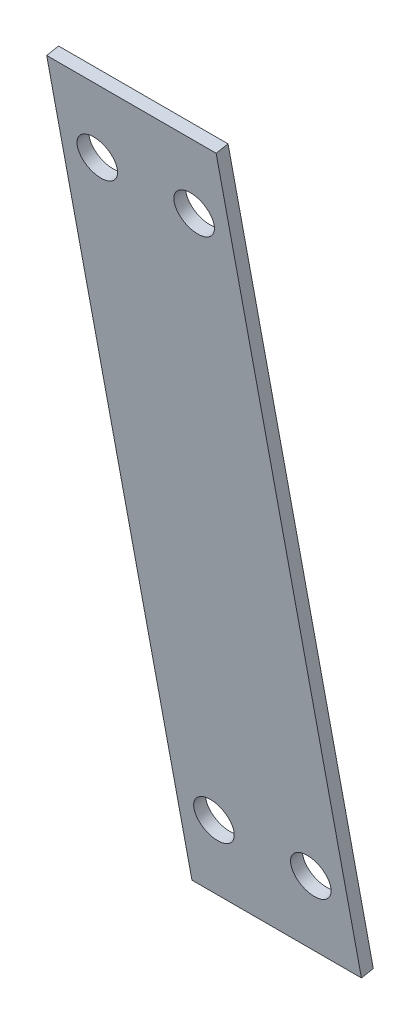
ISO-10303-21;
HEADER;
FILE_DESCRIPTION(('STEP AP214'),'2;1');
FILE_NAME('part.step','',(''),(''),'','','');
FILE_SCHEMA(('AUTOMOTIVE_DESIGN { 1 0 10303 214 1 1 1 1 }'));
ENDSEC;
DATA;
#1=APPLICATION_CONTEXT('core data for automotive mechanical design processes');
#2=APPLICATION_PROTOCOL_DEFINITION('international standard','automotive_design',2000,#1);
#3=PRODUCT_CONTEXT('',#1,'mechanical');
#4=PRODUCT('Part','Part','',(#3));
#5=PRODUCT_RELATED_PRODUCT_CATEGORY('part','',(#4));
#6=PRODUCT_DEFINITION_FORMATION('','',#4);
#7=PRODUCT_DEFINITION_CONTEXT('part definition',#1,'design');
#8=PRODUCT_DEFINITION('design','',#6,#7);
#9=PRODUCT_DEFINITION_SHAPE('','',#8);
#10=(LENGTH_UNIT() NAMED_UNIT(*) SI_UNIT(.MILLI.,.METRE.));
#11=(NAMED_UNIT(*) PLANE_ANGLE_UNIT() SI_UNIT($,.RADIAN.));
#12=(NAMED_UNIT(*) SI_UNIT($,.STERADIAN.) SOLID_ANGLE_UNIT());
#13=UNCERTAINTY_MEASURE_WITH_UNIT(LENGTH_MEASURE(1.E-05),#10,'distance_accuracy_value','');
#14=(GEOMETRIC_REPRESENTATION_CONTEXT(3) GLOBAL_UNCERTAINTY_ASSIGNED_CONTEXT((#13)) GLOBAL_UNIT_ASSIGNED_CONTEXT((#10,
#11,#12)) REPRESENTATION_CONTEXT('',''));
#15=CARTESIAN_POINT('',(0.,0.,0.));
#16=DIRECTION('',(0.,0.,1.));
#17=DIRECTION('',(1.,0.,0.));
#18=AXIS2_PLACEMENT_3D('',#15,#16,#17);
#19=CARTESIAN_POINT('',(124.,39.8184525205439,0.983382180387226));
#20=DIRECTION('',(0.,0.983382180387227,0.181547479456101));
#21=DIRECTION('',(0.,-0.181547479456101,0.983382180387227));
#22=AXIS2_PLACEMENT_3D('',#19,#20,#21);
#23=PLANE('',#22);
#24=DIRECTION('',(0.,0.181547479456101,-0.983382180387227));
#25=VECTOR('',#24,1.);
#26=CARTESIAN_POINT('',(96.,39.8184525205439,0.983382180387226));
#27=LINE('',#26,#25);
#28=CARTESIAN_POINT('',(96.,39.8184525205439,0.983382180387226));
#29=VERTEX_POINT('',#28);
#30=CARTESIAN_POINT('',(96.,40.1815474794561,-0.983382180387226));
#31=VERTEX_POINT('',#30);
#32=EDGE_CURVE('E107',#29,#31,#27,.T.);
#33=ORIENTED_EDGE('',*,*,#32,.T.);
#34=DIRECTION('',(-1.,0.,0.));
#35=VECTOR('',#34,1.);
#36=CARTESIAN_POINT('',(124.,40.1815474794561,-0.983382180387226));
#37=LINE('',#36,#35);
#38=CARTESIAN_POINT('',(124.,40.1815474794561,-0.983382180387226));
#39=VERTEX_POINT('',#38);
#40=EDGE_CURVE('E11',#39,#31,#37,.T.);
#41=ORIENTED_EDGE('',*,*,#40,.F.);
#42=DIRECTION('',(0.,0.181547479456101,-0.983382180387227));
#43=VECTOR('',#42,1.);
#44=CARTESIAN_POINT('',(124.,39.8184525205439,0.983382180387226));
#45=LINE('',#44,#43);
#46=CARTESIAN_POINT('',(124.,39.8184525205439,0.983382180387226));
#47=VERTEX_POINT('',#46);
#48=EDGE_CURVE('E94',#47,#39,#45,.T.);
#49=ORIENTED_EDGE('',*,*,#48,.F.);
#50=DIRECTION('',(-1.,0.,0.));
#51=VECTOR('',#50,1.);
#52=CARTESIAN_POINT('',(124.,39.8184525205439,0.983382180387226));
#53=LINE('',#52,#51);
#54=EDGE_CURVE('E103',#47,#29,#53,.T.);
#55=ORIENTED_EDGE('',*,*,#54,.T.);
#56=EDGE_LOOP('',(#33,#41,#49,#55));
#57=FACE_BOUND('',#56,.T.);
#58=ADVANCED_FACE('F41',(#57),#23,.F.);
#59=CARTESIAN_POINT('',(124.,40.1815474794561,-0.983382180387226));
#60=DIRECTION('',(0.,-0.181547479456103,0.983382180387227));
#61=DIRECTION('',(0.,-0.983382180387227,-0.181547479456103));
#62=AXIS2_PLACEMENT_3D('',#59,#60,#61);
#63=PLANE('',#62);
#64=CARTESIAN_POINT('',(118.,52.9655158244901,1.37673505254212));
#65=DIRECTION('',(0.,-0.181547479456103,0.983382180387227));
#66=DIRECTION('',(0.,-0.983382180387227,-0.181547479456103));
#67=AXIS2_PLACEMENT_3D('',#64,#65,#66);
#68=CIRCLE('',#67,3.3);
#69=CARTESIAN_POINT('',(118.,49.7203546292122,0.777628370336979));
#70=VERTEX_POINT('',#69);
#71=EDGE_CURVE('E110',#70,#70,#68,.T.);
#72=ORIENTED_EDGE('',*,*,#71,.T.);
#73=EDGE_LOOP('',(#72));
#74=FACE_BOUND('',#73,.T.);
#75=CARTESIAN_POINT('',(102.,157.397579134422,20.6565005866834));
#76=DIRECTION('',(0.,-0.181547479456103,0.983382180387227));
#77=DIRECTION('',(0.,-0.983382180387227,-0.181547479456103));
#78=AXIS2_PLACEMENT_3D('',#75,#76,#77);
#79=CIRCLE('',#78,3.3);
#80=CARTESIAN_POINT('',(102.,154.152417939144,20.0573939044783));
#81=VERTEX_POINT('',#80);
#82=EDGE_CURVE('E125',#81,#81,#79,.T.);
#83=ORIENTED_EDGE('',*,*,#82,.T.);
#84=EDGE_LOOP('',(#83));
#85=FACE_BOUND('',#84,.T.);
#86=CARTESIAN_POINT('',(118.,157.397579134422,20.6565005866834));
#87=DIRECTION('',(0.,-0.181547479456103,0.983382180387227));
#88=DIRECTION('',(0.,-0.983382180387227,-0.181547479456103));
#89=AXIS2_PLACEMENT_3D('',#86,#87,#88);
#90=CIRCLE('',#89,3.3);
#91=CARTESIAN_POINT('',(118.,154.152417939144,20.0573939044783));
#92=VERTEX_POINT('',#91);
#93=EDGE_CURVE('E122',#92,#92,#90,.T.);
#94=ORIENTED_EDGE('',*,*,#93,.T.);
#95=EDGE_LOOP('',(#94));
#96=FACE_BOUND('',#95,.T.);
#97=CARTESIAN_POINT('',(102.,52.9655158244901,1.37673505254212));
#98=DIRECTION('',(0.,-0.181547479456103,0.983382180387227));
#99=DIRECTION('',(0.,-0.983382180387227,-0.181547479456103));
#100=AXIS2_PLACEMENT_3D('',#97,#98,#99);
#101=CIRCLE('',#100,3.3);
#102=CARTESIAN_POINT('',(102.,49.7203546292122,0.777628370336979));
#103=VERTEX_POINT('',#102);
#104=EDGE_CURVE('E119',#103,#103,#101,.T.);
#105=ORIENTED_EDGE('',*,*,#104,.T.);
#106=EDGE_LOOP('',(#105));
#107=FACE_BOUND('',#106,.T.);
#108=DIRECTION('',(0.,0.983382180387226,0.181547479456103));
#109=VECTOR('',#108,1.);
#110=CARTESIAN_POINT('',(96.,40.1815474794561,-0.983382180387226));
#111=LINE('',#110,#109);
#112=CARTESIAN_POINT('',(96.,170.181547479456,23.0166178196128));
#113=VERTEX_POINT('',#112);
#114=EDGE_CURVE('E98',#31,#113,#111,.T.);
#115=ORIENTED_EDGE('',*,*,#114,.T.);
#116=DIRECTION('',(-1.,0.,0.));
#117=VECTOR('',#116,1.);
#118=CARTESIAN_POINT('',(124.,170.181547479456,23.0166178196128));
#119=LINE('',#118,#117);
#120=CARTESIAN_POINT('',(124.,170.181547479456,23.0166178196128));
#121=VERTEX_POINT('',#120);
#122=EDGE_CURVE('E50',#121,#113,#119,.T.);
#123=ORIENTED_EDGE('',*,*,#122,.F.);
#124=DIRECTION('',(0.,0.983382180387226,0.181547479456103));
#125=VECTOR('',#124,1.);
#126=CARTESIAN_POINT('',(124.,40.1815474794561,-0.983382180387226));
#127=LINE('',#126,#125);
#128=EDGE_CURVE('E89',#39,#121,#127,.T.);
#129=ORIENTED_EDGE('',*,*,#128,.F.);
#130=ORIENTED_EDGE('',*,*,#40,.T.);
#131=EDGE_LOOP('',(#115,#123,#129,#130));
#132=FACE_BOUND('',#131,.T.);
#133=ADVANCED_FACE('F97',(#74,#85,#96,#107,#132),#63,.F.);
#134=CARTESIAN_POINT('',(124.,170.181547479456,23.0166178196128));
#135=DIRECTION('',(0.,-0.983382180387226,-0.181547479456104));
#136=DIRECTION('',(0.,0.181547479456104,-0.983382180387226));
#137=AXIS2_PLACEMENT_3D('',#134,#135,#136);
#138=PLANE('',#137);
#139=DIRECTION('',(0.,-0.181547479456104,0.983382180387226));
#140=VECTOR('',#139,1.);
#141=CARTESIAN_POINT('',(96.,170.181547479456,23.0166178196128));
#142=LINE('',#141,#140);
#143=CARTESIAN_POINT('',(96.,169.818452520544,24.9833821803872));
#144=VERTEX_POINT('',#143);
#145=EDGE_CURVE('E76',#113,#144,#142,.T.);
#146=ORIENTED_EDGE('',*,*,#145,.T.);
#147=DIRECTION('',(-1.,0.,0.));
#148=VECTOR('',#147,1.);
#149=CARTESIAN_POINT('',(124.,169.818452520544,24.9833821803872));
#150=LINE('',#149,#148);
#151=CARTESIAN_POINT('',(124.,169.818452520544,24.9833821803872));
#152=VERTEX_POINT('',#151);
#153=EDGE_CURVE('E99',#152,#144,#150,.T.);
#154=ORIENTED_EDGE('',*,*,#153,.F.);
#155=DIRECTION('',(0.,-0.181547479456104,0.983382180387226));
#156=VECTOR('',#155,1.);
#157=CARTESIAN_POINT('',(124.,170.181547479456,23.0166178196128));
#158=LINE('',#157,#156);
#159=EDGE_CURVE('E92',#121,#152,#158,.T.);
#160=ORIENTED_EDGE('',*,*,#159,.F.);
#161=ORIENTED_EDGE('',*,*,#122,.T.);
#162=EDGE_LOOP('',(#146,#154,#160,#161));
#163=FACE_BOUND('',#162,.T.);
#164=ADVANCED_FACE('F101',(#163),#138,.F.);
#165=CARTESIAN_POINT('',(124.,169.818452520544,24.9833821803872));
#166=DIRECTION('',(0.,0.181547479456103,-0.983382180387227));
#167=DIRECTION('',(0.,0.983382180387227,0.181547479456103));
#168=AXIS2_PLACEMENT_3D('',#165,#166,#167);
#169=PLANE('',#168);
#170=CARTESIAN_POINT('',(118.,52.6024208655778,3.34349941331658));
#171=DIRECTION('',(0.,0.181547479456103,-0.983382180387227));
#172=DIRECTION('',(0.,0.983382180387227,0.181547479456103));
#173=AXIS2_PLACEMENT_3D('',#170,#171,#172);
#174=CIRCLE('',#173,3.3);
#175=CARTESIAN_POINT('',(118.,55.8475820608557,3.94260609552172));
#176=VERTEX_POINT('',#175);
#177=EDGE_CURVE('E44',#176,#176,#174,.T.);
#178=ORIENTED_EDGE('',*,*,#177,.T.);
#179=EDGE_LOOP('',(#178));
#180=FACE_BOUND('',#179,.T.);
#181=CARTESIAN_POINT('',(102.,157.03448417551,22.6232649474579));
#182=DIRECTION('',(0.,0.181547479456103,-0.983382180387227));
#183=DIRECTION('',(0.,0.983382180387227,0.181547479456103));
#184=AXIS2_PLACEMENT_3D('',#181,#182,#183);
#185=CIRCLE('',#184,3.3);
#186=CARTESIAN_POINT('',(102.,160.279645370788,23.222371629663));
#187=VERTEX_POINT('',#186);
#188=EDGE_CURVE('E123',#187,#187,#185,.T.);
#189=ORIENTED_EDGE('',*,*,#188,.T.);
#190=EDGE_LOOP('',(#189));
#191=FACE_BOUND('',#190,.T.);
#192=CARTESIAN_POINT('',(118.,157.03448417551,22.6232649474579));
#193=DIRECTION('',(0.,0.181547479456103,-0.983382180387227));
#194=DIRECTION('',(0.,0.983382180387227,0.181547479456103));
#195=AXIS2_PLACEMENT_3D('',#192,#193,#194);
#196=CIRCLE('',#195,3.3);
#197=CARTESIAN_POINT('',(118.,160.279645370788,23.222371629663));
#198=VERTEX_POINT('',#197);
#199=EDGE_CURVE('E120',#198,#198,#196,.T.);
#200=ORIENTED_EDGE('',*,*,#199,.T.);
#201=EDGE_LOOP('',(#200));
#202=FACE_BOUND('',#201,.T.);
#203=CARTESIAN_POINT('',(102.,52.6024208655778,3.34349941331658));
#204=DIRECTION('',(0.,0.181547479456103,-0.983382180387227));
#205=DIRECTION('',(0.,0.983382180387227,0.181547479456103));
#206=AXIS2_PLACEMENT_3D('',#203,#204,#205);
#207=CIRCLE('',#206,3.3);
#208=CARTESIAN_POINT('',(102.,55.8475820608557,3.94260609552172));
#209=VERTEX_POINT('',#208);
#210=EDGE_CURVE('E116',#209,#209,#207,.T.);
#211=ORIENTED_EDGE('',*,*,#210,.T.);
#212=EDGE_LOOP('',(#211));
#213=FACE_BOUND('',#212,.T.);
#214=DIRECTION('',(0.,-0.983382180387226,-0.181547479456103));
#215=VECTOR('',#214,1.);
#216=CARTESIAN_POINT('',(96.,169.818452520544,24.9833821803872));
#217=LINE('',#216,#215);
#218=EDGE_CURVE('E82',#144,#29,#217,.T.);
#219=ORIENTED_EDGE('',*,*,#218,.T.);
#220=ORIENTED_EDGE('',*,*,#54,.F.);
#221=DIRECTION('',(0.,-0.983382180387226,-0.181547479456103));
#222=VECTOR('',#221,1.);
#223=CARTESIAN_POINT('',(124.,169.818452520544,24.9833821803872));
#224=LINE('',#223,#222);
#225=EDGE_CURVE('E59',#152,#47,#224,.T.);
#226=ORIENTED_EDGE('',*,*,#225,.F.);
#227=ORIENTED_EDGE('',*,*,#153,.T.);
#228=EDGE_LOOP('',(#219,#220,#226,#227));
#229=FACE_BOUND('',#228,.T.);
#230=ADVANCED_FACE('F142',(#180,#191,#202,#213,#229),#169,.F.);
#231=CARTESIAN_POINT('',(124.,0.,0.));
#232=DIRECTION('',(1.,0.,0.));
#233=DIRECTION('',(0.,0.,-1.));
#234=AXIS2_PLACEMENT_3D('',#231,#232,#233);
#235=PLANE('',#234);
#236=ORIENTED_EDGE('',*,*,#48,.T.);
#237=ORIENTED_EDGE('',*,*,#128,.T.);
#238=ORIENTED_EDGE('',*,*,#159,.T.);
#239=ORIENTED_EDGE('',*,*,#225,.T.);
#240=EDGE_LOOP('',(#236,#237,#238,#239));
#241=FACE_BOUND('',#240,.T.);
#242=ADVANCED_FACE('F90',(#241),#235,.T.);
#243=CARTESIAN_POINT('',(96.,0.,0.));
#244=DIRECTION('',(1.,0.,0.));
#245=DIRECTION('',(0.,0.,-1.));
#246=AXIS2_PLACEMENT_3D('',#243,#244,#245);
#247=PLANE('',#246);
#248=ORIENTED_EDGE('',*,*,#32,.F.);
#249=ORIENTED_EDGE('',*,*,#218,.F.);
#250=ORIENTED_EDGE('',*,*,#145,.F.);
#251=ORIENTED_EDGE('',*,*,#114,.F.);
#252=EDGE_LOOP('',(#248,#249,#250,#251));
#253=FACE_BOUND('',#252,.T.);
#254=ADVANCED_FACE('F164',(#253),#247,.F.);
#255=CARTESIAN_POINT('',(102.,53.3286107834023,-0.590029308232334));
#256=DIRECTION('',(0.,-0.181547479456103,0.983382180387226));
#257=DIRECTION('',(0.,-0.983382180387227,-0.181547479456103));
#258=AXIS2_PLACEMENT_3D('',#255,#256,#257);
#259=CYLINDRICAL_SURFACE('',#258,3.3);
#260=ORIENTED_EDGE('',*,*,#210,.F.);
#261=EDGE_LOOP('',(#260));
#262=FACE_BOUND('',#261,.T.);
#263=ORIENTED_EDGE('',*,*,#104,.F.);
#264=EDGE_LOOP('',(#263));
#265=FACE_BOUND('',#264,.T.);
#266=ADVANCED_FACE('F166',(#262,#265),#259,.F.);
#267=CARTESIAN_POINT('',(118.,157.760674093334,18.689736225909));
#268=DIRECTION('',(0.,-0.181547479456103,0.983382180387226));
#269=DIRECTION('',(0.,-0.983382180387227,-0.181547479456103));
#270=AXIS2_PLACEMENT_3D('',#267,#268,#269);
#271=CYLINDRICAL_SURFACE('',#270,3.3);
#272=ORIENTED_EDGE('',*,*,#199,.F.);
#273=EDGE_LOOP('',(#272));
#274=FACE_BOUND('',#273,.T.);
#275=ORIENTED_EDGE('',*,*,#93,.F.);
#276=EDGE_LOOP('',(#275));
#277=FACE_BOUND('',#276,.T.);
#278=ADVANCED_FACE('F152',(#274,#277),#271,.F.);
#279=CARTESIAN_POINT('',(102.,157.760674093334,18.689736225909));
#280=DIRECTION('',(0.,-0.181547479456103,0.983382180387226));
#281=DIRECTION('',(0.,-0.983382180387227,-0.181547479456103));
#282=AXIS2_PLACEMENT_3D('',#279,#280,#281);
#283=CYLINDRICAL_SURFACE('',#282,3.3);
#284=ORIENTED_EDGE('',*,*,#188,.F.);
#285=EDGE_LOOP('',(#284));
#286=FACE_BOUND('',#285,.T.);
#287=ORIENTED_EDGE('',*,*,#82,.F.);
#288=EDGE_LOOP('',(#287));
#289=FACE_BOUND('',#288,.T.);
#290=ADVANCED_FACE('F147',(#286,#289),#283,.F.);
#291=CARTESIAN_POINT('',(118.,53.3286107834023,-0.590029308232334));
#292=DIRECTION('',(0.,-0.181547479456103,0.983382180387226));
#293=DIRECTION('',(0.,-0.983382180387227,-0.181547479456103));
#294=AXIS2_PLACEMENT_3D('',#291,#292,#293);
#295=CYLINDRICAL_SURFACE('',#294,3.3);
#296=ORIENTED_EDGE('',*,*,#177,.F.);
#297=EDGE_LOOP('',(#296));
#298=FACE_BOUND('',#297,.T.);
#299=ORIENTED_EDGE('',*,*,#71,.F.);
#300=EDGE_LOOP('',(#299));
#301=FACE_BOUND('',#300,.T.);
#302=ADVANCED_FACE('F144',(#298,#301),#295,.F.);
#303=CLOSED_SHELL('',(#58,#133,#164,#230,#242,#254,#266,#278,#290,#302));
#304=MANIFOLD_SOLID_BREP('B2',#303);
#305=ADVANCED_BREP_SHAPE_REPRESENTATION('',(#18,#304),#14);
#306=SHAPE_DEFINITION_REPRESENTATION(#9,#305);
ENDSEC;
END-ISO-10303-21;
